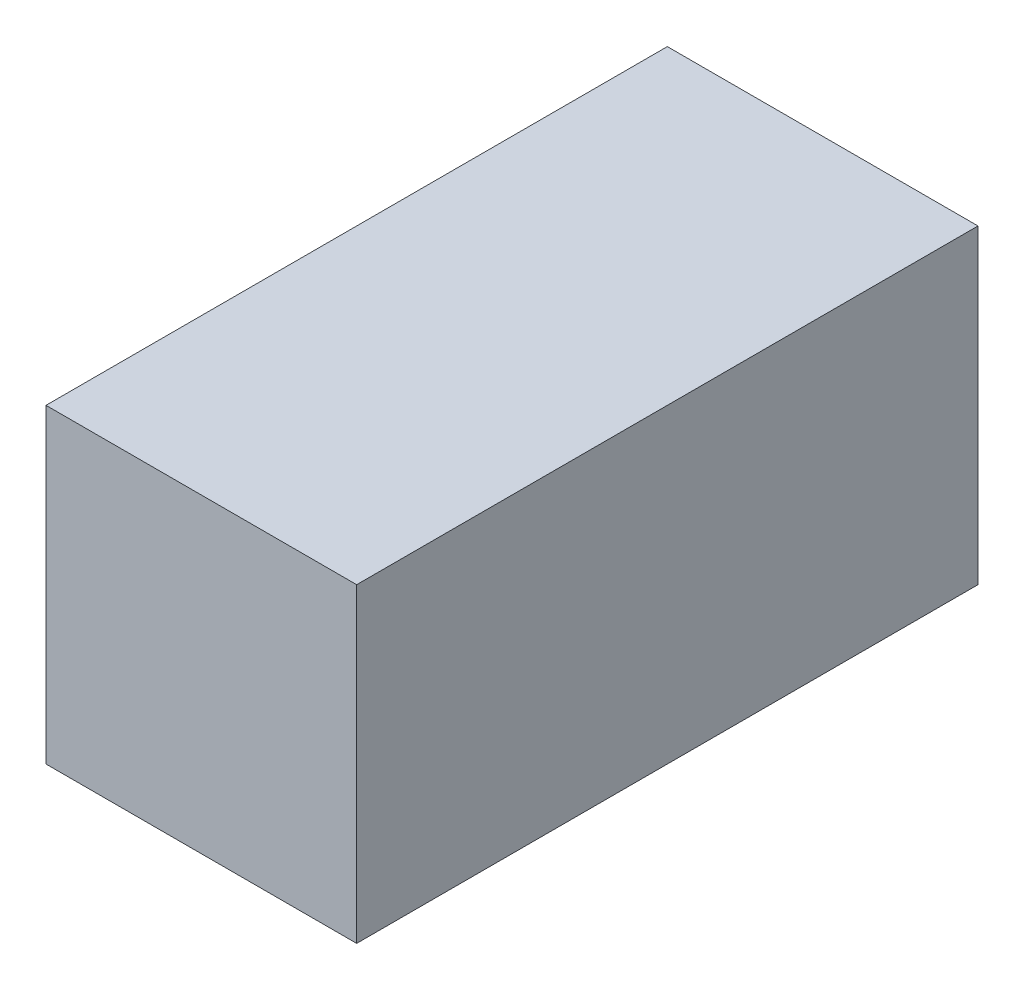
ISO-10303-21;
HEADER;
FILE_DESCRIPTION(('STEP AP214'),'2;1');
FILE_NAME('part.step','',(''),(''),'','','');
FILE_SCHEMA(('AUTOMOTIVE_DESIGN { 1 0 10303 214 1 1 1 1 }'));
ENDSEC;
DATA;
#1=APPLICATION_CONTEXT('core data for automotive mechanical design processes');
#2=APPLICATION_PROTOCOL_DEFINITION('international standard','automotive_design',2000,#1);
#3=PRODUCT_CONTEXT('',#1,'mechanical');
#4=PRODUCT('Part','Part','',(#3));
#5=PRODUCT_RELATED_PRODUCT_CATEGORY('part','',(#4));
#6=PRODUCT_DEFINITION_FORMATION('','',#4);
#7=PRODUCT_DEFINITION_CONTEXT('part definition',#1,'design');
#8=PRODUCT_DEFINITION('design','',#6,#7);
#9=PRODUCT_DEFINITION_SHAPE('','',#8);
#10=(LENGTH_UNIT() NAMED_UNIT(*) SI_UNIT(.MILLI.,.METRE.));
#11=(NAMED_UNIT(*) PLANE_ANGLE_UNIT() SI_UNIT($,.RADIAN.));
#12=(NAMED_UNIT(*) SI_UNIT($,.STERADIAN.) SOLID_ANGLE_UNIT());
#13=UNCERTAINTY_MEASURE_WITH_UNIT(LENGTH_MEASURE(1.E-05),#10,'distance_accuracy_value','');
#14=(GEOMETRIC_REPRESENTATION_CONTEXT(3) GLOBAL_UNCERTAINTY_ASSIGNED_CONTEXT((#13)) GLOBAL_UNIT_ASSIGNED_CONTEXT((#10,
#11,#12)) REPRESENTATION_CONTEXT('',''));
#15=CARTESIAN_POINT('',(0.,0.,0.));
#16=DIRECTION('',(0.,0.,1.));
#17=DIRECTION('',(1.,0.,0.));
#18=AXIS2_PLACEMENT_3D('',#15,#16,#17);
#19=CARTESIAN_POINT('',(0.,0.,20.));
#20=DIRECTION('',(1.,0.,0.));
#21=DIRECTION('',(0.,0.,-1.));
#22=AXIS2_PLACEMENT_3D('',#19,#20,#21);
#23=PLANE('',#22);
#24=DIRECTION('',(0.,-1.,0.));
#25=VECTOR('',#24,1.);
#26=CARTESIAN_POINT('',(0.,0.,0.));
#27=LINE('',#26,#25);
#28=CARTESIAN_POINT('',(0.,10.,0.));
#29=VERTEX_POINT('',#28);
#30=CARTESIAN_POINT('',(0.,0.,0.));
#31=VERTEX_POINT('',#30);
#32=EDGE_CURVE('E106',#29,#31,#27,.T.);
#33=ORIENTED_EDGE('',*,*,#32,.T.);
#34=DIRECTION('',(0.,0.,-1.));
#35=VECTOR('',#34,1.);
#36=CARTESIAN_POINT('',(0.,0.,20.));
#37=LINE('',#36,#35);
#38=CARTESIAN_POINT('',(0.,0.,20.));
#39=VERTEX_POINT('',#38);
#40=EDGE_CURVE('E11',#39,#31,#37,.T.);
#41=ORIENTED_EDGE('',*,*,#40,.F.);
#42=DIRECTION('',(0.,-1.,0.));
#43=VECTOR('',#42,1.);
#44=CARTESIAN_POINT('',(0.,0.,20.));
#45=LINE('',#44,#43);
#46=CARTESIAN_POINT('',(0.,10.,20.));
#47=VERTEX_POINT('',#46);
#48=EDGE_CURVE('E94',#47,#39,#45,.T.);
#49=ORIENTED_EDGE('',*,*,#48,.F.);
#50=DIRECTION('',(0.,0.,-1.));
#51=VECTOR('',#50,1.);
#52=CARTESIAN_POINT('',(0.,10.,20.));
#53=LINE('',#52,#51);
#54=EDGE_CURVE('E105',#47,#29,#53,.T.);
#55=ORIENTED_EDGE('',*,*,#54,.T.);
#56=EDGE_LOOP('',(#33,#41,#49,#55));
#57=FACE_BOUND('',#56,.T.);
#58=ADVANCED_FACE('F43',(#57),#23,.F.);
#59=CARTESIAN_POINT('',(0.,0.,20.));
#60=DIRECTION('',(0.,1.,0.));
#61=DIRECTION('',(0.,0.,1.));
#62=AXIS2_PLACEMENT_3D('',#59,#60,#61);
#63=PLANE('',#62);
#64=DIRECTION('',(1.,0.,0.));
#65=VECTOR('',#64,1.);
#66=CARTESIAN_POINT('',(0.,0.,0.));
#67=LINE('',#66,#65);
#68=CARTESIAN_POINT('',(10.,0.,0.));
#69=VERTEX_POINT('',#68);
#70=EDGE_CURVE('E98',#31,#69,#67,.T.);
#71=ORIENTED_EDGE('',*,*,#70,.T.);
#72=DIRECTION('',(0.,0.,-1.));
#73=VECTOR('',#72,1.);
#74=CARTESIAN_POINT('',(10.,0.,20.));
#75=LINE('',#74,#73);
#76=CARTESIAN_POINT('',(10.,0.,20.));
#77=VERTEX_POINT('',#76);
#78=EDGE_CURVE('E51',#77,#69,#75,.T.);
#79=ORIENTED_EDGE('',*,*,#78,.F.);
#80=DIRECTION('',(1.,0.,0.));
#81=VECTOR('',#80,1.);
#82=CARTESIAN_POINT('',(0.,0.,20.));
#83=LINE('',#82,#81);
#84=EDGE_CURVE('E90',#39,#77,#83,.T.);
#85=ORIENTED_EDGE('',*,*,#84,.F.);
#86=ORIENTED_EDGE('',*,*,#40,.T.);
#87=EDGE_LOOP('',(#71,#79,#85,#86));
#88=FACE_BOUND('',#87,.T.);
#89=ADVANCED_FACE('F100',(#88),#63,.F.);
#90=CARTESIAN_POINT('',(10.,0.,20.));
#91=DIRECTION('',(-1.,0.,0.));
#92=DIRECTION('',(0.,0.,1.));
#93=AXIS2_PLACEMENT_3D('',#90,#91,#92);
#94=PLANE('',#93);
#95=DIRECTION('',(0.,1.,0.));
#96=VECTOR('',#95,1.);
#97=CARTESIAN_POINT('',(10.,0.,0.));
#98=LINE('',#97,#96);
#99=CARTESIAN_POINT('',(10.,10.,0.));
#100=VERTEX_POINT('',#99);
#101=EDGE_CURVE('E76',#69,#100,#98,.T.);
#102=ORIENTED_EDGE('',*,*,#101,.T.);
#103=DIRECTION('',(0.,0.,-1.));
#104=VECTOR('',#103,1.);
#105=CARTESIAN_POINT('',(10.,10.,20.));
#106=LINE('',#105,#104);
#107=CARTESIAN_POINT('',(10.,10.,20.));
#108=VERTEX_POINT('',#107);
#109=EDGE_CURVE('E97',#108,#100,#106,.T.);
#110=ORIENTED_EDGE('',*,*,#109,.F.);
#111=DIRECTION('',(0.,1.,0.));
#112=VECTOR('',#111,1.);
#113=CARTESIAN_POINT('',(10.,0.,20.));
#114=LINE('',#113,#112);
#115=EDGE_CURVE('E95',#77,#108,#114,.T.);
#116=ORIENTED_EDGE('',*,*,#115,.F.);
#117=ORIENTED_EDGE('',*,*,#78,.T.);
#118=EDGE_LOOP('',(#102,#110,#116,#117));
#119=FACE_BOUND('',#118,.T.);
#120=ADVANCED_FACE('F99',(#119),#94,.F.);
#121=CARTESIAN_POINT('',(0.,10.,20.));
#122=DIRECTION('',(0.,-1.,0.));
#123=DIRECTION('',(0.,0.,-1.));
#124=AXIS2_PLACEMENT_3D('',#121,#122,#123);
#125=PLANE('',#124);
#126=DIRECTION('',(-1.,0.,0.));
#127=VECTOR('',#126,1.);
#128=CARTESIAN_POINT('',(0.,10.,0.));
#129=LINE('',#128,#127);
#130=EDGE_CURVE('E85',#100,#29,#129,.T.);
#131=ORIENTED_EDGE('',*,*,#130,.T.);
#132=ORIENTED_EDGE('',*,*,#54,.F.);
#133=DIRECTION('',(-1.,0.,0.));
#134=VECTOR('',#133,1.);
#135=CARTESIAN_POINT('',(0.,10.,20.));
#136=LINE('',#135,#134);
#137=EDGE_CURVE('E56',#108,#47,#136,.T.);
#138=ORIENTED_EDGE('',*,*,#137,.F.);
#139=ORIENTED_EDGE('',*,*,#109,.T.);
#140=EDGE_LOOP('',(#131,#132,#138,#139));
#141=FACE_BOUND('',#140,.T.);
#142=ADVANCED_FACE('F114',(#141),#125,.F.);
#143=CARTESIAN_POINT('',(0.,0.,20.));
#144=DIRECTION('',(0.,0.,-1.));
#145=DIRECTION('',(-1.,0.,0.));
#146=AXIS2_PLACEMENT_3D('',#143,#144,#145);
#147=PLANE('',#146);
#148=ORIENTED_EDGE('',*,*,#48,.T.);
#149=ORIENTED_EDGE('',*,*,#84,.T.);
#150=ORIENTED_EDGE('',*,*,#115,.T.);
#151=ORIENTED_EDGE('',*,*,#137,.T.);
#152=EDGE_LOOP('',(#148,#149,#150,#151));
#153=FACE_BOUND('',#152,.T.);
#154=ADVANCED_FACE('F89',(#153),#147,.F.);
#155=CARTESIAN_POINT('',(0.,0.,0.));
#156=DIRECTION('',(0.,0.,-1.));
#157=DIRECTION('',(-1.,0.,0.));
#158=AXIS2_PLACEMENT_3D('',#155,#156,#157);
#159=PLANE('',#158);
#160=ORIENTED_EDGE('',*,*,#32,.F.);
#161=ORIENTED_EDGE('',*,*,#130,.F.);
#162=ORIENTED_EDGE('',*,*,#101,.F.);
#163=ORIENTED_EDGE('',*,*,#70,.F.);
#164=EDGE_LOOP('',(#160,#161,#162,#163));
#165=FACE_BOUND('',#164,.T.);
#166=ADVANCED_FACE('F116',(#165),#159,.T.);
#167=CLOSED_SHELL('',(#58,#89,#120,#142,#154,#166));
#168=MANIFOLD_SOLID_BREP('B2',#167);
#169=ADVANCED_BREP_SHAPE_REPRESENTATION('',(#18,#168),#14);
#170=SHAPE_DEFINITION_REPRESENTATION(#9,#169);
ENDSEC;
END-ISO-10303-21;
